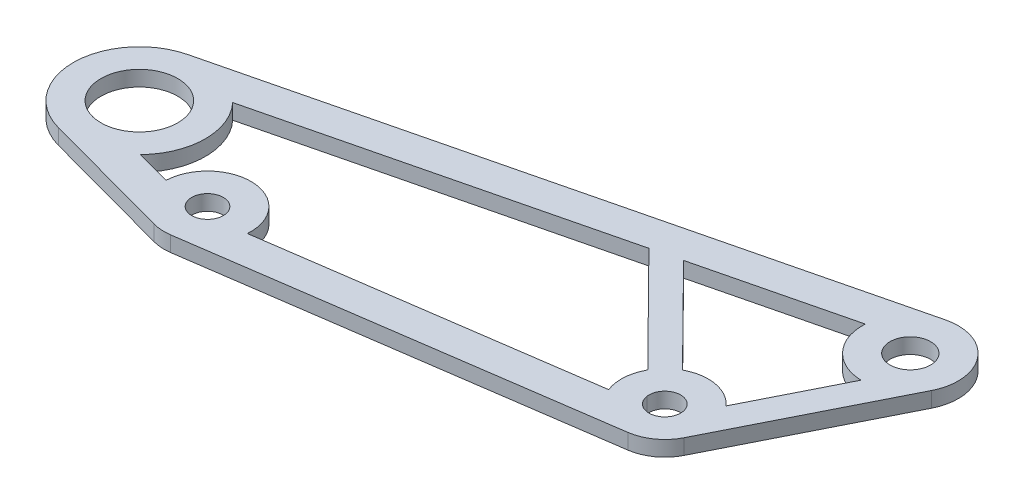
ISO-10303-21;
HEADER;
FILE_DESCRIPTION(('STEP AP214'),'2;1');
FILE_NAME('part.step','',(''),(''),'','','');
FILE_SCHEMA(('AUTOMOTIVE_DESIGN { 1 0 10303 214 1 1 1 1 }'));
ENDSEC;
DATA;
#1=APPLICATION_CONTEXT('core data for automotive mechanical design processes');
#2=APPLICATION_PROTOCOL_DEFINITION('international standard','automotive_design',2000,#1);
#3=PRODUCT_CONTEXT('',#1,'mechanical');
#4=PRODUCT('Part','Part','',(#3));
#5=PRODUCT_RELATED_PRODUCT_CATEGORY('part','',(#4));
#6=PRODUCT_DEFINITION_FORMATION('','',#4);
#7=PRODUCT_DEFINITION_CONTEXT('part definition',#1,'design');
#8=PRODUCT_DEFINITION('design','',#6,#7);
#9=PRODUCT_DEFINITION_SHAPE('','',#8);
#10=(LENGTH_UNIT() NAMED_UNIT(*) SI_UNIT(.MILLI.,.METRE.));
#11=(NAMED_UNIT(*) PLANE_ANGLE_UNIT() SI_UNIT($,.RADIAN.));
#12=(NAMED_UNIT(*) SI_UNIT($,.STERADIAN.) SOLID_ANGLE_UNIT());
#13=UNCERTAINTY_MEASURE_WITH_UNIT(LENGTH_MEASURE(1.E-05),#10,'distance_accuracy_value','');
#14=(GEOMETRIC_REPRESENTATION_CONTEXT(3) GLOBAL_UNCERTAINTY_ASSIGNED_CONTEXT((#13)) GLOBAL_UNIT_ASSIGNED_CONTEXT((#10,
#11,#12)) REPRESENTATION_CONTEXT('',''));
#15=CARTESIAN_POINT('',(0.,0.,0.));
#16=DIRECTION('',(0.,0.,1.));
#17=DIRECTION('',(1.,0.,0.));
#18=AXIS2_PLACEMENT_3D('',#15,#16,#17);
#19=CARTESIAN_POINT('',(108.585,-3.175,0.));
#20=DIRECTION('',(0.,1.,0.));
#21=DIRECTION('',(0.,0.,1.));
#22=AXIS2_PLACEMENT_3D('',#19,#20,#21);
#23=CYLINDRICAL_SURFACE('',#22,3.26389999999999);
#24=CARTESIAN_POINT('',(108.585,-3.175,0.));
#25=DIRECTION('',(0.,1.,0.));
#26=DIRECTION('',(0.,0.,1.));
#27=AXIS2_PLACEMENT_3D('',#24,#25,#26);
#28=CIRCLE('',#27,3.26389999999999);
#29=CARTESIAN_POINT('',(111.817923837064,-3.175,-0.448605253810657));
#30=VERTEX_POINT('',#29);
#31=CARTESIAN_POINT('',(105.352076162936,-3.175,0.448605253810657));
#32=VERTEX_POINT('',#31);
#33=EDGE_CURVE('E305',#30,#32,#28,.T.);
#34=ORIENTED_EDGE('',*,*,#33,.F.);
#35=DIRECTION('',(0.,1.,0.));
#36=VECTOR('',#35,1.);
#37=CARTESIAN_POINT('',(111.817923837064,-3.175,-0.448605253810657));
#38=LINE('',#37,#36);
#39=CARTESIAN_POINT('',(111.817923837064,0.,-0.448605253810657));
#40=VERTEX_POINT('',#39);
#41=EDGE_CURVE('E11',#30,#40,#38,.T.);
#42=ORIENTED_EDGE('',*,*,#41,.T.);
#43=CARTESIAN_POINT('',(108.585,0.,0.));
#44=DIRECTION('',(0.,1.,0.));
#45=DIRECTION('',(0.,0.,1.));
#46=AXIS2_PLACEMENT_3D('',#43,#44,#45);
#47=CIRCLE('',#46,3.26389999999999);
#48=CARTESIAN_POINT('',(105.352076162936,0.,0.448605253810657));
#49=VERTEX_POINT('',#48);
#50=EDGE_CURVE('E395',#40,#49,#47,.T.);
#51=ORIENTED_EDGE('',*,*,#50,.T.);
#52=DIRECTION('',(0.,-1.,0.));
#53=VECTOR('',#52,1.);
#54=CARTESIAN_POINT('',(105.352076162936,-3.175,0.448605253810658));
#55=LINE('',#54,#53);
#56=EDGE_CURVE('E60',#49,#32,#55,.T.);
#57=ORIENTED_EDGE('',*,*,#56,.T.);
#58=EDGE_LOOP('',(#34,#42,#51,#57));
#59=FACE_BOUND('',#58,.T.);
#60=ADVANCED_FACE('F51',(#59),#23,.F.);
#61=CARTESIAN_POINT('',(124.877763157895,-3.175,-34.4406136513383));
#62=DIRECTION('',(0.,1.,0.));
#63=DIRECTION('',(0.,0.,1.));
#64=AXIS2_PLACEMENT_3D('',#61,#62,#63);
#65=CYLINDRICAL_SURFACE('',#64,9.90600000000001);
#66=CARTESIAN_POINT('',(124.877763157895,0.,-34.4406136513383));
#67=DIRECTION('',(0.,1.,0.));
#68=DIRECTION('',(0.,0.,1.));
#69=AXIS2_PLACEMENT_3D('',#66,#67,#68);
#70=CIRCLE('',#69,9.90600000000001);
#71=CARTESIAN_POINT('',(114.989082679769,0.,-35.0261342756799));
#72=VERTEX_POINT('',#71);
#73=CARTESIAN_POINT('',(124.586881969925,0.,-24.5388853105644));
#74=VERTEX_POINT('',#73);
#75=EDGE_CURVE('E379',#72,#74,#70,.T.);
#76=ORIENTED_EDGE('',*,*,#75,.F.);
#77=DIRECTION('',(0.,1.,0.));
#78=VECTOR('',#77,1.);
#79=CARTESIAN_POINT('',(114.989082679769,-3.175,-35.0261342756799));
#80=LINE('',#79,#78);
#81=CARTESIAN_POINT('',(114.989082679769,-3.175,-35.0261342756799));
#82=VERTEX_POINT('',#81);
#83=EDGE_CURVE('E398',#82,#72,#80,.T.);
#84=ORIENTED_EDGE('',*,*,#83,.F.);
#85=CARTESIAN_POINT('',(124.877763157895,-3.175,-34.4406136513383));
#86=DIRECTION('',(0.,1.,0.));
#87=DIRECTION('',(0.,0.,1.));
#88=AXIS2_PLACEMENT_3D('',#85,#86,#87);
#89=CIRCLE('',#88,9.90600000000001);
#90=CARTESIAN_POINT('',(124.586881969925,-3.175,-24.5388853105644));
#91=VERTEX_POINT('',#90);
#92=EDGE_CURVE('E291',#82,#91,#89,.T.);
#93=ORIENTED_EDGE('',*,*,#92,.T.);
#94=DIRECTION('',(0.,1.,0.));
#95=VECTOR('',#94,1.);
#96=CARTESIAN_POINT('',(124.586881969925,-3.175,-24.5388853105644));
#97=LINE('',#96,#95);
#98=EDGE_CURVE('E410',#91,#74,#97,.T.);
#99=ORIENTED_EDGE('',*,*,#98,.T.);
#100=EDGE_LOOP('',(#76,#84,#93,#99));
#101=FACE_BOUND('',#100,.T.);
#102=ADVANCED_FACE('F488',(#101),#65,.T.);
#103=CARTESIAN_POINT('',(-1.58604279813385,-3.175,-6.47611183446425));
#104=DIRECTION('',(0.237876685134435,0.,0.97129536324923));
#105=DIRECTION('',(0.97129536324923,0.,-0.237876685134435));
#106=AXIS2_PLACEMENT_3D('',#103,#104,#105);
#107=PLANE('',#106);
#108=DIRECTION('',(0.97129536324923,0.,-0.237876685134435));
#109=VECTOR('',#108,1.);
#110=CARTESIAN_POINT('',(-1.58604279813385,0.,-6.47611183446425));
#111=LINE('',#110,#109);
#112=CARTESIAN_POINT('',(84.8234756350019,0.,-27.638376771235));
#113=VERTEX_POINT('',#112);
#114=EDGE_CURVE('E391',#113,#72,#111,.T.);
#115=ORIENTED_EDGE('',*,*,#114,.F.);
#116=DIRECTION('',(0.,1.,0.));
#117=VECTOR('',#116,1.);
#118=CARTESIAN_POINT('',(84.8234756350019,-3.175,-27.638376771235));
#119=LINE('',#118,#117);
#120=CARTESIAN_POINT('',(84.8234756350019,-3.175,-27.638376771235));
#121=VERTEX_POINT('',#120);
#122=EDGE_CURVE('E401',#121,#113,#119,.T.);
#123=ORIENTED_EDGE('',*,*,#122,.F.);
#124=DIRECTION('',(0.97129536324923,0.,-0.237876685134435));
#125=VECTOR('',#124,1.);
#126=CARTESIAN_POINT('',(-1.58604279813385,-3.175,-6.47611183446425));
#127=LINE('',#126,#125);
#128=EDGE_CURVE('E301',#121,#82,#127,.T.);
#129=ORIENTED_EDGE('',*,*,#128,.T.);
#130=ORIENTED_EDGE('',*,*,#83,.T.);
#131=EDGE_LOOP('',(#115,#123,#129,#130));
#132=FACE_BOUND('',#131,.T.);
#133=ADVANCED_FACE('F490',(#132),#107,.T.);
#134=CARTESIAN_POINT('',(56.6998859694459,-3.175,-56.075244693864));
#135=DIRECTION('',(-0.711012412833097,0.,0.703179457035867));
#136=DIRECTION('',(0.703179457035867,0.,0.711012412833097));
#137=AXIS2_PLACEMENT_3D('',#134,#135,#136);
#138=PLANE('',#137);
#139=DIRECTION('',(0.703179457035867,0.,0.711012412833097));
#140=VECTOR('',#139,1.);
#141=CARTESIAN_POINT('',(56.6998859694459,0.,-56.075244693864));
#142=LINE('',#141,#140);
#143=CARTESIAN_POINT('',(104.335087932163,0.,-7.90941797009474));
#144=VERTEX_POINT('',#143);
#145=EDGE_CURVE('E387',#113,#144,#142,.T.);
#146=ORIENTED_EDGE('',*,*,#145,.T.);
#147=DIRECTION('',(0.,1.,0.));
#148=VECTOR('',#147,1.);
#149=CARTESIAN_POINT('',(104.335087932163,-3.175,-7.90941797009474));
#150=LINE('',#149,#148);
#151=CARTESIAN_POINT('',(104.335087932163,-3.175,-7.90941797009474));
#152=VERTEX_POINT('',#151);
#153=EDGE_CURVE('E404',#152,#144,#150,.T.);
#154=ORIENTED_EDGE('',*,*,#153,.F.);
#155=DIRECTION('',(0.703179457035867,0.,0.711012412833097));
#156=VECTOR('',#155,1.);
#157=CARTESIAN_POINT('',(56.6998859694459,-3.175,-56.075244693864));
#158=LINE('',#157,#156);
#159=EDGE_CURVE('E298',#121,#152,#158,.T.);
#160=ORIENTED_EDGE('',*,*,#159,.F.);
#161=ORIENTED_EDGE('',*,*,#122,.T.);
#162=EDGE_LOOP('',(#146,#154,#160,#161));
#163=FACE_BOUND('',#162,.T.);
#164=ADVANCED_FACE('F474',(#163),#138,.F.);
#165=CARTESIAN_POINT('',(108.585,-3.175,0.));
#166=DIRECTION('',(0.,1.,0.));
#167=DIRECTION('',(0.,0.,1.));
#168=AXIS2_PLACEMENT_3D('',#165,#166,#167);
#169=CYLINDRICAL_SURFACE('',#168,8.9789);
#170=CARTESIAN_POINT('',(108.585,0.,0.));
#171=DIRECTION('',(0.,1.,0.));
#172=DIRECTION('',(0.,0.,1.));
#173=AXIS2_PLACEMENT_3D('',#170,#171,#172);
#174=CIRCLE('',#173,8.9789);
#175=CARTESIAN_POINT('',(115.260501821769,0.,-6.00485808637935));
#176=VERTEX_POINT('',#175);
#177=EDGE_CURVE('E335',#176,#144,#174,.T.);
#178=ORIENTED_EDGE('',*,*,#177,.F.);
#179=DIRECTION('',(0.,1.,0.));
#180=VECTOR('',#179,1.);
#181=CARTESIAN_POINT('',(115.260501821769,-3.175,-6.00485808637935));
#182=LINE('',#181,#180);
#183=CARTESIAN_POINT('',(115.260501821769,-3.175,-6.00485808637935));
#184=VERTEX_POINT('',#183);
#185=EDGE_CURVE('E407',#184,#176,#182,.T.);
#186=ORIENTED_EDGE('',*,*,#185,.F.);
#187=CARTESIAN_POINT('',(108.585,-3.175,0.));
#188=DIRECTION('',(0.,1.,0.));
#189=DIRECTION('',(0.,0.,1.));
#190=AXIS2_PLACEMENT_3D('',#187,#188,#189);
#191=CIRCLE('',#190,8.9789);
#192=EDGE_CURVE('E249',#184,#152,#191,.T.);
#193=ORIENTED_EDGE('',*,*,#192,.T.);
#194=ORIENTED_EDGE('',*,*,#153,.T.);
#195=EDGE_LOOP('',(#178,#186,#193,#194));
#196=FACE_BOUND('',#195,.T.);
#197=ADVANCED_FACE('F465',(#196),#169,.T.);
#198=CARTESIAN_POINT('',(-3.57647156903051,-3.175,13.1757203736994));
#199=DIRECTION('',(-0.261964590297053,0.,0.965077485713192));
#200=DIRECTION('',(0.965077485713192,0.,0.261964590297053));
#201=AXIS2_PLACEMENT_3D('',#198,#199,#200);
#202=PLANE('',#201);
#203=DIRECTION('',(0.965077485713192,0.,0.261964590297053));
#204=VECTOR('',#203,1.);
#205=CARTESIAN_POINT('',(-3.57647156903051,0.,13.1757203736994));
#206=LINE('',#205,#204);
#207=CARTESIAN_POINT('',(-3.57647156903051,0.,13.1757203736994));
#208=VERTEX_POINT('',#207);
#209=CARTESIAN_POINT('',(23.6292679562019,0.,20.560557875311));
#210=VERTEX_POINT('',#209);
#211=EDGE_CURVE('E339',#208,#210,#206,.T.);
#212=ORIENTED_EDGE('',*,*,#211,.F.);
#213=DIRECTION('',(0.,1.,0.));
#214=VECTOR('',#213,1.);
#215=CARTESIAN_POINT('',(-3.57647156903051,-3.175,13.1757203736994));
#216=LINE('',#215,#214);
#217=CARTESIAN_POINT('',(-3.57647156903051,-3.175,13.1757203736994));
#218=VERTEX_POINT('',#217);
#219=EDGE_CURVE('E413',#218,#208,#216,.T.);
#220=ORIENTED_EDGE('',*,*,#219,.F.);
#221=DIRECTION('',(0.965077485713192,0.,0.261964590297053));
#222=VECTOR('',#221,1.);
#223=CARTESIAN_POINT('',(-3.57647156903051,-3.175,13.1757203736994));
#224=LINE('',#223,#222);
#225=CARTESIAN_POINT('',(23.6292679562019,-3.175,20.560557875311));
#226=VERTEX_POINT('',#225);
#227=EDGE_CURVE('E252',#218,#226,#224,.T.);
#228=ORIENTED_EDGE('',*,*,#227,.T.);
#229=DIRECTION('',(0.,1.,0.));
#230=VECTOR('',#229,1.);
#231=CARTESIAN_POINT('',(23.6292679562019,-3.175,20.560557875311));
#232=LINE('',#231,#230);
#233=EDGE_CURVE('E434',#226,#210,#232,.T.);
#234=ORIENTED_EDGE('',*,*,#233,.T.);
#235=EDGE_LOOP('',(#212,#220,#228,#234));
#236=FACE_BOUND('',#235,.T.);
#237=ADVANCED_FACE('F550',(#236),#202,.T.);
#238=CARTESIAN_POINT('',(0.,-3.175,0.));
#239=DIRECTION('',(0.,1.,0.));
#240=DIRECTION('',(0.,0.,1.));
#241=AXIS2_PLACEMENT_3D('',#238,#239,#240);
#242=CYLINDRICAL_SURFACE('',#241,13.6525);
#243=CARTESIAN_POINT('',(0.,0.,0.));
#244=DIRECTION('',(0.,1.,0.));
#245=DIRECTION('',(0.,0.,1.));
#246=AXIS2_PLACEMENT_3D('',#243,#244,#245);
#247=CIRCLE('',#246,13.6525);
#248=CARTESIAN_POINT('',(-3.24761144379787,0.,-13.2606099467601));
#249=VERTEX_POINT('',#248);
#250=EDGE_CURVE('E367',#249,#208,#247,.T.);
#251=ORIENTED_EDGE('',*,*,#250,.F.);
#252=DIRECTION('',(0.,1.,0.));
#253=VECTOR('',#252,1.);
#254=CARTESIAN_POINT('',(-3.24761144379787,-3.175,-13.2606099467601));
#255=LINE('',#254,#253);
#256=CARTESIAN_POINT('',(-3.24761144379787,-3.175,-13.2606099467601));
#257=VERTEX_POINT('',#256);
#258=EDGE_CURVE('E416',#257,#249,#255,.T.);
#259=ORIENTED_EDGE('',*,*,#258,.F.);
#260=CARTESIAN_POINT('',(0.,-3.175,0.));
#261=DIRECTION('',(0.,1.,0.));
#262=DIRECTION('',(0.,0.,1.));
#263=AXIS2_PLACEMENT_3D('',#260,#261,#262);
#264=CIRCLE('',#263,13.6525);
#265=EDGE_CURVE('E279',#257,#218,#264,.T.);
#266=ORIENTED_EDGE('',*,*,#265,.T.);
#267=ORIENTED_EDGE('',*,*,#219,.T.);
#268=EDGE_LOOP('',(#251,#259,#266,#267));
#269=FACE_BOUND('',#268,.T.);
#270=ADVANCED_FACE('F546',(#269),#242,.T.);
#271=CARTESIAN_POINT('',(-3.24761144379787,-3.175,-13.2606099467601));
#272=DIRECTION('',(0.237876685134435,0.,0.97129536324923));
#273=DIRECTION('',(0.97129536324923,0.,-0.237876685134435));
#274=AXIS2_PLACEMENT_3D('',#271,#272,#273);
#275=PLANE('',#274);
#276=DIRECTION('',(0.97129536324923,0.,-0.237876685134435));
#277=VECTOR('',#276,1.);
#278=CARTESIAN_POINT('',(-3.24761144379787,0.,-13.2606099467601));
#279=LINE('',#278,#277);
#280=CARTESIAN_POINT('',(122.521356714953,0.,-44.0622655196852));
#281=VERTEX_POINT('',#280);
#282=EDGE_CURVE('E363',#249,#281,#279,.T.);
#283=ORIENTED_EDGE('',*,*,#282,.T.);
#284=DIRECTION('',(0.,1.,0.));
#285=VECTOR('',#284,1.);
#286=CARTESIAN_POINT('',(122.521356714953,-3.175,-44.0622655196852));
#287=LINE('',#286,#285);
#288=CARTESIAN_POINT('',(122.521356714953,-3.175,-44.0622655196852));
#289=VERTEX_POINT('',#288);
#290=EDGE_CURVE('E419',#289,#281,#287,.T.);
#291=ORIENTED_EDGE('',*,*,#290,.F.);
#292=DIRECTION('',(0.97129536324923,0.,-0.237876685134435));
#293=VECTOR('',#292,1.);
#294=CARTESIAN_POINT('',(-3.24761144379787,-3.175,-13.2606099467601));
#295=LINE('',#294,#293);
#296=EDGE_CURVE('E276',#257,#289,#295,.T.);
#297=ORIENTED_EDGE('',*,*,#296,.F.);
#298=ORIENTED_EDGE('',*,*,#258,.T.);
#299=EDGE_LOOP('',(#283,#291,#297,#298));
#300=FACE_BOUND('',#299,.T.);
#301=ADVANCED_FACE('F549',(#300),#275,.F.);
#302=CARTESIAN_POINT('',(124.877763157895,-3.175,-34.4406136513383));
#303=DIRECTION('',(0.,1.,0.));
#304=DIRECTION('',(0.,0.,1.));
#305=AXIS2_PLACEMENT_3D('',#302,#303,#304);
#306=CYLINDRICAL_SURFACE('',#305,9.90600000000001);
#307=CARTESIAN_POINT('',(124.877763157895,0.,-34.4406136513383));
#308=DIRECTION('',(0.,1.,0.));
#309=DIRECTION('',(0.,0.,1.));
#310=AXIS2_PLACEMENT_3D('',#307,#308,#309);
#311=CIRCLE('',#310,9.90600000000001);
#312=CARTESIAN_POINT('',(133.726592386017,0.,-29.9878552600113));
#313=VERTEX_POINT('',#312);
#314=EDGE_CURVE('E359',#313,#281,#311,.T.);
#315=ORIENTED_EDGE('',*,*,#314,.F.);
#316=DIRECTION('',(0.,1.,0.));
#317=VECTOR('',#316,1.);
#318=CARTESIAN_POINT('',(133.726592386017,-3.175,-29.9878552600113));
#319=LINE('',#318,#317);
#320=CARTESIAN_POINT('',(133.726592386017,-3.175,-29.9878552600113));
#321=VERTEX_POINT('',#320);
#322=EDGE_CURVE('E422',#321,#313,#319,.T.);
#323=ORIENTED_EDGE('',*,*,#322,.F.);
#324=CARTESIAN_POINT('',(124.877763157895,-3.175,-34.4406136513383));
#325=DIRECTION('',(0.,1.,0.));
#326=DIRECTION('',(0.,0.,1.));
#327=AXIS2_PLACEMENT_3D('',#324,#325,#326);
#328=CIRCLE('',#327,9.90600000000001);
#329=EDGE_CURVE('E272',#321,#289,#328,.T.);
#330=ORIENTED_EDGE('',*,*,#329,.T.);
#331=ORIENTED_EDGE('',*,*,#290,.T.);
#332=EDGE_LOOP('',(#315,#323,#330,#331));
#333=FACE_BOUND('',#332,.T.);
#334=ADVANCED_FACE('F554',(#333),#306,.T.);
#335=CARTESIAN_POINT('',(94.6659309182432,-3.175,47.636190890583));
#336=DIRECTION('',(0.893279752485568,0.,0.449501149942158));
#337=DIRECTION('',(0.449501149942158,0.,-0.893279752485568));
#338=AXIS2_PLACEMENT_3D('',#335,#336,#337);
#339=PLANE('',#338);
#340=DIRECTION('',(0.449501149942158,0.,-0.893279752485568));
#341=VECTOR('',#340,1.);
#342=CARTESIAN_POINT('',(94.6659309182432,0.,47.636190890583));
#343=LINE('',#342,#341);
#344=CARTESIAN_POINT('',(116.605669569593,0.,4.03602587521565));
#345=VERTEX_POINT('',#344);
#346=EDGE_CURVE('E355',#345,#313,#343,.T.);
#347=ORIENTED_EDGE('',*,*,#346,.F.);
#348=DIRECTION('',(0.,1.,0.));
#349=VECTOR('',#348,1.);
#350=CARTESIAN_POINT('',(116.605669569593,-3.175,4.03602587521565));
#351=LINE('',#350,#349);
#352=CARTESIAN_POINT('',(116.605669569593,-3.175,4.03602587521565));
#353=VERTEX_POINT('',#352);
#354=EDGE_CURVE('E425',#353,#345,#351,.T.);
#355=ORIENTED_EDGE('',*,*,#354,.F.);
#356=DIRECTION('',(0.449501149942158,0.,-0.893279752485568));
#357=VECTOR('',#356,1.);
#358=CARTESIAN_POINT('',(94.6659309182432,-3.175,47.636190890583));
#359=LINE('',#358,#357);
#360=EDGE_CURVE('E268',#353,#321,#359,.T.);
#361=ORIENTED_EDGE('',*,*,#360,.T.);
#362=ORIENTED_EDGE('',*,*,#322,.T.);
#363=EDGE_LOOP('',(#347,#355,#361,#362));
#364=FACE_BOUND('',#363,.T.);
#365=ADVANCED_FACE('F558',(#364),#339,.T.);
#366=CARTESIAN_POINT('',(108.585,-3.175,0.));
#367=DIRECTION('',(0.,1.,0.));
#368=DIRECTION('',(0.,0.,1.));
#369=AXIS2_PLACEMENT_3D('',#366,#367,#368);
#370=CYLINDRICAL_SURFACE('',#369,8.9789);
#371=CARTESIAN_POINT('',(108.585,0.,0.));
#372=DIRECTION('',(0.,1.,0.));
#373=DIRECTION('',(0.,0.,1.));
#374=AXIS2_PLACEMENT_3D('',#371,#372,#373);
#375=CIRCLE('',#374,8.9789);
#376=CARTESIAN_POINT('',(109.864793621202,0.,8.88722529798427));
#377=VERTEX_POINT('',#376);
#378=EDGE_CURVE('E351',#377,#345,#375,.T.);
#379=ORIENTED_EDGE('',*,*,#378,.F.);
#380=DIRECTION('',(0.,1.,0.));
#381=VECTOR('',#380,1.);
#382=CARTESIAN_POINT('',(109.864793621202,-3.175,8.88722529798427));
#383=LINE('',#382,#381);
#384=CARTESIAN_POINT('',(109.864793621202,-3.175,8.88722529798427));
#385=VERTEX_POINT('',#384);
#386=EDGE_CURVE('E428',#385,#377,#383,.T.);
#387=ORIENTED_EDGE('',*,*,#386,.F.);
#388=CARTESIAN_POINT('',(108.585,-3.175,0.));
#389=DIRECTION('',(0.,1.,0.));
#390=DIRECTION('',(0.,0.,1.));
#391=AXIS2_PLACEMENT_3D('',#388,#389,#390);
#392=CIRCLE('',#391,8.9789);
#393=EDGE_CURVE('E264',#385,#353,#392,.T.);
#394=ORIENTED_EDGE('',*,*,#393,.T.);
#395=ORIENTED_EDGE('',*,*,#354,.T.);
#396=EDGE_LOOP('',(#379,#387,#394,#395));
#397=FACE_BOUND('',#396,.T.);
#398=ADVANCED_FACE('F562',(#397),#370,.T.);
#399=CARTESIAN_POINT('',(3.48578315996742,-3.175,24.2061999445375));
#400=DIRECTION('',(0.142533453006673,0.,0.989789985185744));
#401=DIRECTION('',(0.989789985185744,0.,-0.142533453006673));
#402=AXIS2_PLACEMENT_3D('',#399,#400,#401);
#403=PLANE('',#402);
#404=DIRECTION('',(0.989789985185744,0.,-0.142533453006673));
#405=VECTOR('',#404,1.);
#406=CARTESIAN_POINT('',(3.48578315996742,0.,24.2061999445375));
#407=LINE('',#406,#405);
#408=CARTESIAN_POINT('',(27.2612154372217,0.,20.7824489368251));
#409=VERTEX_POINT('',#408);
#410=EDGE_CURVE('E347',#409,#377,#407,.T.);
#411=ORIENTED_EDGE('',*,*,#410,.F.);
#412=DIRECTION('',(0.,1.,0.));
#413=VECTOR('',#412,1.);
#414=CARTESIAN_POINT('',(27.2612154372217,-3.175,20.7824489368251));
#415=LINE('',#414,#413);
#416=CARTESIAN_POINT('',(27.2612154372217,-3.175,20.7824489368251));
#417=VERTEX_POINT('',#416);
#418=EDGE_CURVE('E431',#417,#409,#415,.T.);
#419=ORIENTED_EDGE('',*,*,#418,.F.);
#420=DIRECTION('',(0.989789985185744,0.,-0.142533453006673));
#421=VECTOR('',#420,1.);
#422=CARTESIAN_POINT('',(3.48578315996742,-3.175,24.2061999445375));
#423=LINE('',#422,#421);
#424=EDGE_CURVE('E260',#417,#385,#423,.T.);
#425=ORIENTED_EDGE('',*,*,#424,.T.);
#426=ORIENTED_EDGE('',*,*,#386,.T.);
#427=EDGE_LOOP('',(#411,#419,#425,#426));
#428=FACE_BOUND('',#427,.T.);
#429=ADVANCED_FACE('F566',(#428),#403,.T.);
#430=CARTESIAN_POINT('',(25.9814218160201,-3.175,11.8952236388408));
#431=DIRECTION('',(0.,1.,0.));
#432=DIRECTION('',(0.,0.,1.));
#433=AXIS2_PLACEMENT_3D('',#430,#431,#432);
#434=CYLINDRICAL_SURFACE('',#433,8.9789);
#435=CARTESIAN_POINT('',(25.9814218160201,0.,11.8952236388408));
#436=DIRECTION('',(0.,1.,0.));
#437=DIRECTION('',(0.,0.,1.));
#438=AXIS2_PLACEMENT_3D('',#435,#436,#437);
#439=CIRCLE('',#438,8.9789);
#440=CARTESIAN_POINT('',(34.9309469870368,0.,12.6209263488657));
#441=VERTEX_POINT('',#440);
#442=CARTESIAN_POINT('',(17.0101137524519,0.,11.5260667093969));
#443=VERTEX_POINT('',#442);
#444=EDGE_CURVE('E313',#441,#443,#439,.T.);
#445=ORIENTED_EDGE('',*,*,#444,.F.);
#446=DIRECTION('',(0.,1.,0.));
#447=VECTOR('',#446,1.);
#448=CARTESIAN_POINT('',(34.9309469870368,-3.175,12.6209263488657));
#449=LINE('',#448,#447);
#450=CARTESIAN_POINT('',(34.9309469870368,-3.175,12.6209263488657));
#451=VERTEX_POINT('',#450);
#452=EDGE_CURVE('E224',#451,#441,#449,.T.);
#453=ORIENTED_EDGE('',*,*,#452,.F.);
#454=CARTESIAN_POINT('',(25.9814218160201,-3.175,11.8952236388408));
#455=DIRECTION('',(0.,1.,0.));
#456=DIRECTION('',(0.,0.,1.));
#457=AXIS2_PLACEMENT_3D('',#454,#455,#456);
#458=CIRCLE('',#457,8.9789);
#459=CARTESIAN_POINT('',(17.0101137524519,-3.175,11.5260667093969));
#460=VERTEX_POINT('',#459);
#461=EDGE_CURVE('E204',#451,#460,#458,.T.);
#462=ORIENTED_EDGE('',*,*,#461,.T.);
#463=DIRECTION('',(0.,1.,0.));
#464=VECTOR('',#463,1.);
#465=CARTESIAN_POINT('',(17.0101137524519,-3.175,11.5260667093969));
#466=LINE('',#465,#464);
#467=EDGE_CURVE('E212',#460,#443,#466,.T.);
#468=ORIENTED_EDGE('',*,*,#467,.T.);
#469=EDGE_LOOP('',(#445,#453,#462,#468));
#470=FACE_BOUND('',#469,.T.);
#471=ADVANCED_FACE('F223',(#470),#434,.T.);
#472=CARTESIAN_POINT('',(2.4901869907158,-3.175,17.2925168980151));
#473=DIRECTION('',(0.142533453006673,0.,0.989789985185744));
#474=DIRECTION('',(0.989789985185744,0.,-0.142533453006673));
#475=AXIS2_PLACEMENT_3D('',#472,#473,#474);
#476=PLANE('',#475);
#477=DIRECTION('',(0.989789985185744,0.,-0.142533453006673));
#478=VECTOR('',#477,1.);
#479=CARTESIAN_POINT('',(2.4901869907158,0.,17.2925168980151));
#480=LINE('',#479,#478);
#481=CARTESIAN_POINT('',(100.203869732883,0.,3.22138179289876));
#482=VERTEX_POINT('',#481);
#483=EDGE_CURVE('E334',#441,#482,#480,.T.);
#484=ORIENTED_EDGE('',*,*,#483,.T.);
#485=DIRECTION('',(0.,1.,0.));
#486=VECTOR('',#485,1.);
#487=CARTESIAN_POINT('',(100.203869732883,-3.175,3.22138179289876));
#488=LINE('',#487,#486);
#489=CARTESIAN_POINT('',(100.203869732883,-3.175,3.22138179289876));
#490=VERTEX_POINT('',#489);
#491=EDGE_CURVE('E439',#490,#482,#488,.T.);
#492=ORIENTED_EDGE('',*,*,#491,.F.);
#493=DIRECTION('',(0.989789985185744,0.,-0.142533453006673));
#494=VECTOR('',#493,1.);
#495=CARTESIAN_POINT('',(2.4901869907158,-3.175,17.2925168980151));
#496=LINE('',#495,#494);
#497=EDGE_CURVE('E248',#451,#490,#496,.T.);
#498=ORIENTED_EDGE('',*,*,#497,.F.);
#499=ORIENTED_EDGE('',*,*,#452,.T.);
#500=EDGE_LOOP('',(#484,#492,#498,#499));
#501=FACE_BOUND('',#500,.T.);
#502=ADVANCED_FACE('F577',(#501),#476,.F.);
#503=CARTESIAN_POINT('',(100.723144874971,0.,-4.33726632835253));
#504=VERTEX_POINT('',#503);
#505=EDGE_CURVE('E330',#504,#482,#174,.T.);
#506=ORIENTED_EDGE('',*,*,#505,.F.);
#507=DIRECTION('',(0.,1.,0.));
#508=VECTOR('',#507,1.);
#509=CARTESIAN_POINT('',(100.723144874971,-3.175,-4.33726632835253));
#510=LINE('',#509,#508);
#511=CARTESIAN_POINT('',(100.723144874971,-3.175,-4.33726632835253));
#512=VERTEX_POINT('',#511);
#513=EDGE_CURVE('E442',#512,#504,#510,.T.);
#514=ORIENTED_EDGE('',*,*,#513,.F.);
#515=EDGE_CURVE('E244',#512,#490,#191,.T.);
#516=ORIENTED_EDGE('',*,*,#515,.T.);
#517=ORIENTED_EDGE('',*,*,#491,.T.);
#518=EDGE_LOOP('',(#506,#514,#516,#517));
#519=FACE_BOUND('',#518,.T.);
#520=ADVANCED_FACE('F580',(#519),#169,.T.);
#521=CARTESIAN_POINT('',(53.0879429122537,-3.175,-52.5030930521218));
#522=DIRECTION('',(-0.711012412833097,0.,0.703179457035868));
#523=DIRECTION('',(0.703179457035868,0.,0.711012412833097));
#524=AXIS2_PLACEMENT_3D('',#521,#522,#523);
#525=PLANE('',#524);
#526=DIRECTION('',(0.703179457035868,0.,0.711012412833097));
#527=VECTOR('',#526,1.);
#528=CARTESIAN_POINT('',(53.0879429122537,0.,-52.5030930521218));
#529=LINE('',#528,#527);
#530=CARTESIAN_POINT('',(79.0718316140536,0.,-26.2297609520473));
#531=VERTEX_POINT('',#530);
#532=EDGE_CURVE('E326',#531,#504,#529,.T.);
#533=ORIENTED_EDGE('',*,*,#532,.F.);
#534=DIRECTION('',(0.,1.,0.));
#535=VECTOR('',#534,1.);
#536=CARTESIAN_POINT('',(79.0718316140536,-3.175,-26.2297609520473));
#537=LINE('',#536,#535);
#538=CARTESIAN_POINT('',(79.0718316140536,-3.175,-26.2297609520473));
#539=VERTEX_POINT('',#538);
#540=EDGE_CURVE('E445',#539,#531,#537,.T.);
#541=ORIENTED_EDGE('',*,*,#540,.F.);
#542=DIRECTION('',(0.703179457035868,0.,0.711012412833097));
#543=VECTOR('',#542,1.);
#544=CARTESIAN_POINT('',(53.0879429122537,-3.175,-52.5030930521218));
#545=LINE('',#544,#543);
#546=EDGE_CURVE('E240',#539,#512,#545,.T.);
#547=ORIENTED_EDGE('',*,*,#546,.T.);
#548=ORIENTED_EDGE('',*,*,#513,.T.);
#549=EDGE_LOOP('',(#533,#541,#547,#548));
#550=FACE_BOUND('',#549,.T.);
#551=ADVANCED_FACE('F582',(#550),#525,.T.);
#552=CARTESIAN_POINT('',(-1.58604279813385,-3.175,-6.47611183446425));
#553=DIRECTION('',(0.237876685134435,0.,0.97129536324923));
#554=DIRECTION('',(0.97129536324923,0.,-0.237876685134435));
#555=AXIS2_PLACEMENT_3D('',#552,#553,#554);
#556=PLANE('',#555);
#557=DIRECTION('',(0.97129536324923,0.,-0.237876685134435));
#558=VECTOR('',#557,1.);
#559=CARTESIAN_POINT('',(-1.58604279813385,0.,-6.47611183446425));
#560=LINE('',#559,#558);
#561=CARTESIAN_POINT('',(9.98563606310428,0.,-9.31009283870098));
#562=VERTEX_POINT('',#561);
#563=EDGE_CURVE('E322',#562,#531,#560,.T.);
#564=ORIENTED_EDGE('',*,*,#563,.F.);
#565=DIRECTION('',(0.,1.,0.));
#566=VECTOR('',#565,1.);
#567=CARTESIAN_POINT('',(9.98563606310428,-3.175,-9.31009283870098));
#568=LINE('',#567,#566);
#569=CARTESIAN_POINT('',(9.98563606310428,-3.175,-9.31009283870098));
#570=VERTEX_POINT('',#569);
#571=EDGE_CURVE('E448',#570,#562,#568,.T.);
#572=ORIENTED_EDGE('',*,*,#571,.F.);
#573=DIRECTION('',(0.97129536324923,0.,-0.237876685134435));
#574=VECTOR('',#573,1.);
#575=CARTESIAN_POINT('',(-1.58604279813385,-3.175,-6.47611183446425));
#576=LINE('',#575,#574);
#577=EDGE_CURVE('E236',#570,#539,#576,.T.);
#578=ORIENTED_EDGE('',*,*,#577,.T.);
#579=ORIENTED_EDGE('',*,*,#540,.T.);
#580=EDGE_LOOP('',(#564,#572,#578,#579));
#581=FACE_BOUND('',#580,.T.);
#582=ADVANCED_FACE('F585',(#581),#556,.T.);
#583=CARTESIAN_POINT('',(0.,-3.175,0.));
#584=DIRECTION('',(0.,1.,0.));
#585=DIRECTION('',(0.,0.,1.));
#586=AXIS2_PLACEMENT_3D('',#583,#584,#585);
#587=CYLINDRICAL_SURFACE('',#586,13.6525);
#588=CARTESIAN_POINT('',(0.,0.,0.));
#589=DIRECTION('',(0.,1.,0.));
#590=DIRECTION('',(0.,0.,1.));
#591=AXIS2_PLACEMENT_3D('',#588,#589,#590);
#592=CIRCLE('',#591,13.6525);
#593=CARTESIAN_POINT('',(9.75095230123182,0.,9.55561015681897));
#594=VERTEX_POINT('',#593);
#595=EDGE_CURVE('E318',#594,#562,#592,.T.);
#596=ORIENTED_EDGE('',*,*,#595,.F.);
#597=DIRECTION('',(0.,1.,0.));
#598=VECTOR('',#597,1.);
#599=CARTESIAN_POINT('',(9.75095230123182,-3.175,9.55561015681897));
#600=LINE('',#599,#598);
#601=CARTESIAN_POINT('',(9.75095230123182,-3.175,9.55561015681897));
#602=VERTEX_POINT('',#601);
#603=EDGE_CURVE('E220',#602,#594,#600,.T.);
#604=ORIENTED_EDGE('',*,*,#603,.F.);
#605=CARTESIAN_POINT('',(0.,-3.175,0.));
#606=DIRECTION('',(0.,1.,0.));
#607=DIRECTION('',(0.,0.,1.));
#608=AXIS2_PLACEMENT_3D('',#605,#606,#607);
#609=CIRCLE('',#608,13.6525);
#610=EDGE_CURVE('E207',#602,#570,#609,.T.);
#611=ORIENTED_EDGE('',*,*,#610,.T.);
#612=ORIENTED_EDGE('',*,*,#571,.T.);
#613=EDGE_LOOP('',(#596,#604,#611,#612));
#614=FACE_BOUND('',#613,.T.);
#615=ADVANCED_FACE('F542',(#614),#587,.T.);
#616=CARTESIAN_POINT('',(89.5608371327882,-3.175,45.0672918186636));
#617=DIRECTION('',(0.893279752485568,0.,0.449501149942159));
#618=DIRECTION('',(0.449501149942159,0.,-0.893279752485568));
#619=AXIS2_PLACEMENT_3D('',#616,#617,#618);
#620=PLANE('',#619);
#621=DIRECTION('',(0.449501149942159,0.,-0.893279752485568));
#622=VECTOR('',#621,1.);
#623=CARTESIAN_POINT('',(89.5608371327882,0.,45.0672918186636));
#624=LINE('',#623,#622);
#625=EDGE_CURVE('E383',#176,#74,#624,.T.);
#626=ORIENTED_EDGE('',*,*,#625,.T.);
#627=ORIENTED_EDGE('',*,*,#98,.F.);
#628=DIRECTION('',(0.449501149942159,0.,-0.893279752485568));
#629=VECTOR('',#628,1.);
#630=CARTESIAN_POINT('',(89.5608371327882,-3.175,45.0672918186636));
#631=LINE('',#630,#629);
#632=EDGE_CURVE('E295',#184,#91,#631,.T.);
#633=ORIENTED_EDGE('',*,*,#632,.F.);
#634=ORIENTED_EDGE('',*,*,#185,.T.);
#635=EDGE_LOOP('',(#626,#627,#633,#634));
#636=FACE_BOUND('',#635,.T.);
#637=ADVANCED_FACE('F486',(#636),#620,.F.);
#638=CARTESIAN_POINT('',(124.877763157895,-3.175,-34.4406136513383));
#639=DIRECTION('',(0.,1.,0.));
#640=DIRECTION('',(0.,0.,1.));
#641=AXIS2_PLACEMENT_3D('',#638,#639,#640);
#642=CYLINDRICAL_SURFACE('',#641,4.191);
#643=CARTESIAN_POINT('',(124.877763157895,-3.175,-34.4406136513383));
#644=DIRECTION('',(0.,1.,0.));
#645=DIRECTION('',(0.,0.,1.));
#646=AXIS2_PLACEMENT_3D('',#643,#644,#645);
#647=CIRCLE('',#646,4.191);
#648=CARTESIAN_POINT('',(124.877763157895,-3.175,-30.2496136513383));
#649=VERTEX_POINT('',#648);
#650=EDGE_CURVE('E287',#649,#649,#647,.T.);
#651=ORIENTED_EDGE('',*,*,#650,.F.);
#652=EDGE_LOOP('',(#651));
#653=FACE_BOUND('',#652,.T.);
#654=CARTESIAN_POINT('',(124.877763157895,0.,-34.4406136513383));
#655=DIRECTION('',(0.,1.,0.));
#656=DIRECTION('',(0.,0.,1.));
#657=AXIS2_PLACEMENT_3D('',#654,#655,#656);
#658=CIRCLE('',#657,4.191);
#659=CARTESIAN_POINT('',(124.877763157895,0.,-30.2496136513383));
#660=VERTEX_POINT('',#659);
#661=EDGE_CURVE('E375',#660,#660,#658,.T.);
#662=ORIENTED_EDGE('',*,*,#661,.T.);
#663=EDGE_LOOP('',(#662));
#664=FACE_BOUND('',#663,.T.);
#665=ADVANCED_FACE('F531',(#653,#664),#642,.F.);
#666=CARTESIAN_POINT('',(0.,-3.175,0.));
#667=DIRECTION('',(0.,1.,0.));
#668=DIRECTION('',(0.,0.,1.));
#669=AXIS2_PLACEMENT_3D('',#666,#667,#668);
#670=CYLINDRICAL_SURFACE('',#669,7.9375);
#671=CARTESIAN_POINT('',(0.,-3.175,0.));
#672=DIRECTION('',(0.,1.,0.));
#673=DIRECTION('',(0.,0.,1.));
#674=AXIS2_PLACEMENT_3D('',#671,#672,#673);
#675=CIRCLE('',#674,7.9375);
#676=CARTESIAN_POINT('',(0.,-3.175,7.9375));
#677=VERTEX_POINT('',#676);
#678=EDGE_CURVE('E283',#677,#677,#675,.T.);
#679=ORIENTED_EDGE('',*,*,#678,.F.);
#680=EDGE_LOOP('',(#679));
#681=FACE_BOUND('',#680,.T.);
#682=CARTESIAN_POINT('',(0.,0.,0.));
#683=DIRECTION('',(0.,1.,0.));
#684=DIRECTION('',(0.,0.,1.));
#685=AXIS2_PLACEMENT_3D('',#682,#683,#684);
#686=CIRCLE('',#685,7.9375);
#687=CARTESIAN_POINT('',(0.,0.,7.9375));
#688=VERTEX_POINT('',#687);
#689=EDGE_CURVE('E371',#688,#688,#686,.T.);
#690=ORIENTED_EDGE('',*,*,#689,.T.);
#691=EDGE_LOOP('',(#690));
#692=FACE_BOUND('',#691,.T.);
#693=ADVANCED_FACE('F533',(#681,#692),#670,.F.);
#694=CARTESIAN_POINT('',(25.9814218160201,-3.175,11.8952236388408));
#695=DIRECTION('',(0.,1.,0.));
#696=DIRECTION('',(0.,0.,1.));
#697=AXIS2_PLACEMENT_3D('',#694,#695,#696);
#698=CYLINDRICAL_SURFACE('',#697,8.9789);
#699=CARTESIAN_POINT('',(25.9814218160201,0.,11.8952236388408));
#700=DIRECTION('',(0.,1.,0.));
#701=DIRECTION('',(0.,0.,1.));
#702=AXIS2_PLACEMENT_3D('',#699,#700,#701);
#703=CIRCLE('',#702,8.9789);
#704=EDGE_CURVE('E343',#210,#409,#703,.T.);
#705=ORIENTED_EDGE('',*,*,#704,.F.);
#706=ORIENTED_EDGE('',*,*,#233,.F.);
#707=CARTESIAN_POINT('',(25.9814218160201,-3.175,11.8952236388408));
#708=DIRECTION('',(0.,1.,0.));
#709=DIRECTION('',(0.,0.,1.));
#710=AXIS2_PLACEMENT_3D('',#707,#708,#709);
#711=CIRCLE('',#710,8.9789);
#712=EDGE_CURVE('E256',#226,#417,#711,.T.);
#713=ORIENTED_EDGE('',*,*,#712,.T.);
#714=ORIENTED_EDGE('',*,*,#418,.T.);
#715=EDGE_LOOP('',(#705,#706,#713,#714));
#716=FACE_BOUND('',#715,.T.);
#717=ADVANCED_FACE('F515',(#716),#698,.T.);
#718=CARTESIAN_POINT('',(-1.7466489058056,-3.175,6.43465413599271));
#719=DIRECTION('',(-0.261964590297053,0.,0.965077485713193));
#720=DIRECTION('',(0.965077485713193,0.,0.261964590297053));
#721=AXIS2_PLACEMENT_3D('',#718,#719,#720);
#722=PLANE('',#721);
#723=DIRECTION('',(0.965077485713193,0.,0.261964590297053));
#724=VECTOR('',#723,1.);
#725=CARTESIAN_POINT('',(-1.7466489058056,0.,6.43465413599271));
#726=LINE('',#725,#724);
#727=EDGE_CURVE('E215',#594,#443,#726,.T.);
#728=ORIENTED_EDGE('',*,*,#727,.T.);
#729=ORIENTED_EDGE('',*,*,#467,.F.);
#730=DIRECTION('',(0.965077485713193,0.,0.261964590297053));
#731=VECTOR('',#730,1.);
#732=CARTESIAN_POINT('',(-1.7466489058056,-3.175,6.43465413599271));
#733=LINE('',#732,#731);
#734=EDGE_CURVE('E199',#602,#460,#733,.T.);
#735=ORIENTED_EDGE('',*,*,#734,.F.);
#736=ORIENTED_EDGE('',*,*,#603,.T.);
#737=EDGE_LOOP('',(#728,#729,#735,#736));
#738=FACE_BOUND('',#737,.T.);
#739=ADVANCED_FACE('F213',(#738),#722,.F.);
#740=CARTESIAN_POINT('',(25.9814218160201,-3.175,11.8952236388408));
#741=DIRECTION('',(0.,1.,0.));
#742=DIRECTION('',(0.,0.,1.));
#743=AXIS2_PLACEMENT_3D('',#740,#741,#742);
#744=CYLINDRICAL_SURFACE('',#743,3.2639);
#745=CARTESIAN_POINT('',(25.9814218160201,-3.175,11.8952236388408));
#746=DIRECTION('',(0.,1.,0.));
#747=DIRECTION('',(0.,0.,1.));
#748=AXIS2_PLACEMENT_3D('',#745,#746,#747);
#749=CIRCLE('',#748,3.2639);
#750=CARTESIAN_POINT('',(25.9814218160201,-3.175,15.1591236388408));
#751=VERTEX_POINT('',#750);
#752=EDGE_CURVE('E227',#751,#751,#749,.T.);
#753=ORIENTED_EDGE('',*,*,#752,.F.);
#754=EDGE_LOOP('',(#753));
#755=FACE_BOUND('',#754,.T.);
#756=CARTESIAN_POINT('',(25.9814218160201,0.,11.8952236388408));
#757=DIRECTION('',(0.,1.,0.));
#758=DIRECTION('',(0.,0.,1.));
#759=AXIS2_PLACEMENT_3D('',#756,#757,#758);
#760=CIRCLE('',#759,3.2639);
#761=CARTESIAN_POINT('',(25.9814218160201,0.,15.1591236388408));
#762=VERTEX_POINT('',#761);
#763=EDGE_CURVE('E309',#762,#762,#760,.T.);
#764=ORIENTED_EDGE('',*,*,#763,.T.);
#765=EDGE_LOOP('',(#764));
#766=FACE_BOUND('',#765,.T.);
#767=ADVANCED_FACE('F53',(#755,#766),#744,.F.);
#768=ORIENTED_EDGE('',*,*,#41,.F.);
#769=EDGE_CURVE('E221',#32,#30,#28,.T.);
#770=ORIENTED_EDGE('',*,*,#769,.F.);
#771=ORIENTED_EDGE('',*,*,#56,.F.);
#772=EDGE_CURVE('E231',#49,#40,#47,.T.);
#773=ORIENTED_EDGE('',*,*,#772,.T.);
#774=EDGE_LOOP('',(#768,#770,#771,#773));
#775=FACE_BOUND('',#774,.T.);
#776=ADVANCED_FACE('F457',(#775),#23,.F.);
#777=CARTESIAN_POINT('',(0.,-3.175,0.));
#778=DIRECTION('',(0.,1.,0.));
#779=DIRECTION('',(0.,0.,1.));
#780=AXIS2_PLACEMENT_3D('',#777,#778,#779);
#781=PLANE('',#780);
#782=ORIENTED_EDGE('',*,*,#752,.T.);
#783=EDGE_LOOP('',(#782));
#784=FACE_BOUND('',#783,.T.);
#785=ORIENTED_EDGE('',*,*,#461,.F.);
#786=ORIENTED_EDGE('',*,*,#497,.T.);
#787=ORIENTED_EDGE('',*,*,#515,.F.);
#788=ORIENTED_EDGE('',*,*,#546,.F.);
#789=ORIENTED_EDGE('',*,*,#577,.F.);
#790=ORIENTED_EDGE('',*,*,#610,.F.);
#791=ORIENTED_EDGE('',*,*,#734,.T.);
#792=EDGE_LOOP('',(#785,#786,#787,#788,#789,#790,#791));
#793=FACE_BOUND('',#792,.T.);
#794=ORIENTED_EDGE('',*,*,#227,.F.);
#795=ORIENTED_EDGE('',*,*,#265,.F.);
#796=ORIENTED_EDGE('',*,*,#296,.T.);
#797=ORIENTED_EDGE('',*,*,#329,.F.);
#798=ORIENTED_EDGE('',*,*,#360,.F.);
#799=ORIENTED_EDGE('',*,*,#393,.F.);
#800=ORIENTED_EDGE('',*,*,#424,.F.);
#801=ORIENTED_EDGE('',*,*,#712,.F.);
#802=EDGE_LOOP('',(#794,#795,#796,#797,#798,#799,#800,#801));
#803=FACE_BOUND('',#802,.T.);
#804=ORIENTED_EDGE('',*,*,#678,.T.);
#805=EDGE_LOOP('',(#804));
#806=FACE_BOUND('',#805,.T.);
#807=ORIENTED_EDGE('',*,*,#650,.T.);
#808=EDGE_LOOP('',(#807));
#809=FACE_BOUND('',#808,.T.);
#810=ORIENTED_EDGE('',*,*,#92,.F.);
#811=ORIENTED_EDGE('',*,*,#128,.F.);
#812=ORIENTED_EDGE('',*,*,#159,.T.);
#813=ORIENTED_EDGE('',*,*,#192,.F.);
#814=ORIENTED_EDGE('',*,*,#632,.T.);
#815=EDGE_LOOP('',(#810,#811,#812,#813,#814));
#816=FACE_BOUND('',#815,.T.);
#817=ORIENTED_EDGE('',*,*,#769,.T.);
#818=ORIENTED_EDGE('',*,*,#33,.T.);
#819=EDGE_LOOP('',(#817,#818));
#820=FACE_BOUND('',#819,.T.);
#821=ADVANCED_FACE('F201',(#784,#793,#803,#806,#809,#816,#820),#781,.F.);
#822=CARTESIAN_POINT('',(0.,0.,0.));
#823=DIRECTION('',(0.,1.,0.));
#824=DIRECTION('',(0.,0.,1.));
#825=AXIS2_PLACEMENT_3D('',#822,#823,#824);
#826=PLANE('',#825);
#827=ORIENTED_EDGE('',*,*,#763,.F.);
#828=EDGE_LOOP('',(#827));
#829=FACE_BOUND('',#828,.T.);
#830=ORIENTED_EDGE('',*,*,#444,.T.);
#831=ORIENTED_EDGE('',*,*,#727,.F.);
#832=ORIENTED_EDGE('',*,*,#595,.T.);
#833=ORIENTED_EDGE('',*,*,#563,.T.);
#834=ORIENTED_EDGE('',*,*,#532,.T.);
#835=ORIENTED_EDGE('',*,*,#505,.T.);
#836=ORIENTED_EDGE('',*,*,#483,.F.);
#837=EDGE_LOOP('',(#830,#831,#832,#833,#834,#835,#836));
#838=FACE_BOUND('',#837,.T.);
#839=ORIENTED_EDGE('',*,*,#211,.T.);
#840=ORIENTED_EDGE('',*,*,#704,.T.);
#841=ORIENTED_EDGE('',*,*,#410,.T.);
#842=ORIENTED_EDGE('',*,*,#378,.T.);
#843=ORIENTED_EDGE('',*,*,#346,.T.);
#844=ORIENTED_EDGE('',*,*,#314,.T.);
#845=ORIENTED_EDGE('',*,*,#282,.F.);
#846=ORIENTED_EDGE('',*,*,#250,.T.);
#847=EDGE_LOOP('',(#839,#840,#841,#842,#843,#844,#845,#846));
#848=FACE_BOUND('',#847,.T.);
#849=ORIENTED_EDGE('',*,*,#689,.F.);
#850=EDGE_LOOP('',(#849));
#851=FACE_BOUND('',#850,.T.);
#852=ORIENTED_EDGE('',*,*,#661,.F.);
#853=EDGE_LOOP('',(#852));
#854=FACE_BOUND('',#853,.T.);
#855=ORIENTED_EDGE('',*,*,#75,.T.);
#856=ORIENTED_EDGE('',*,*,#625,.F.);
#857=ORIENTED_EDGE('',*,*,#177,.T.);
#858=ORIENTED_EDGE('',*,*,#145,.F.);
#859=ORIENTED_EDGE('',*,*,#114,.T.);
#860=EDGE_LOOP('',(#855,#856,#857,#858,#859));
#861=FACE_BOUND('',#860,.T.);
#862=ORIENTED_EDGE('',*,*,#772,.F.);
#863=ORIENTED_EDGE('',*,*,#50,.F.);
#864=EDGE_LOOP('',(#862,#863));
#865=FACE_BOUND('',#864,.T.);
#866=ADVANCED_FACE('F480',(#829,#838,#848,#851,#854,#861,#865),#826,.T.);
#867=CLOSED_SHELL('',(#60,#102,#133,#164,#197,#237,#270,#301,#334,#365,#398,#429,#471,#502,#520,
#551,#582,#615,#637,#665,#693,#717,#739,#767,#776,#821,#866));
#868=MANIFOLD_SOLID_BREP('B2',#867);
#869=ADVANCED_BREP_SHAPE_REPRESENTATION('',(#18,#868),#14);
#870=SHAPE_DEFINITION_REPRESENTATION(#9,#869);
ENDSEC;
END-ISO-10303-21;
